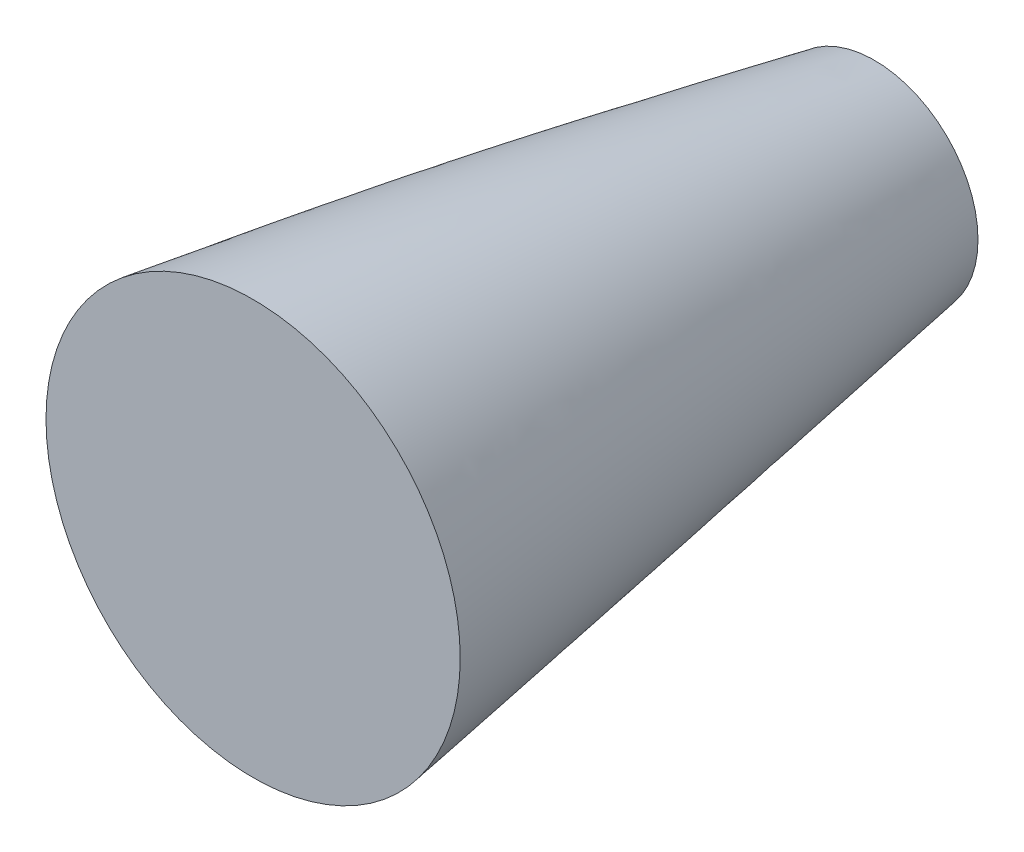
ISO-10303-21;
HEADER;
FILE_DESCRIPTION(('STEP AP214'),'2;1');
FILE_NAME('part.step','',(''),(''),'','','');
FILE_SCHEMA(('AUTOMOTIVE_DESIGN { 1 0 10303 214 1 1 1 1 }'));
ENDSEC;
DATA;
#1=APPLICATION_CONTEXT('core data for automotive mechanical design processes');
#2=APPLICATION_PROTOCOL_DEFINITION('international standard','automotive_design',2000,#1);
#3=PRODUCT_CONTEXT('',#1,'mechanical');
#4=PRODUCT('Part','Part','',(#3));
#5=PRODUCT_RELATED_PRODUCT_CATEGORY('part','',(#4));
#6=PRODUCT_DEFINITION_FORMATION('','',#4);
#7=PRODUCT_DEFINITION_CONTEXT('part definition',#1,'design');
#8=PRODUCT_DEFINITION('design','',#6,#7);
#9=PRODUCT_DEFINITION_SHAPE('','',#8);
#10=(LENGTH_UNIT() NAMED_UNIT(*) SI_UNIT(.MILLI.,.METRE.));
#11=(NAMED_UNIT(*) PLANE_ANGLE_UNIT() SI_UNIT($,.RADIAN.));
#12=(NAMED_UNIT(*) SI_UNIT($,.STERADIAN.) SOLID_ANGLE_UNIT());
#13=UNCERTAINTY_MEASURE_WITH_UNIT(LENGTH_MEASURE(1.E-05),#10,'distance_accuracy_value','');
#14=(GEOMETRIC_REPRESENTATION_CONTEXT(3) GLOBAL_UNCERTAINTY_ASSIGNED_CONTEXT((#13)) GLOBAL_UNIT_ASSIGNED_CONTEXT((#10,
#11,#12)) REPRESENTATION_CONTEXT('',''));
#15=CARTESIAN_POINT('',(0.,0.,0.));
#16=DIRECTION('',(0.,0.,1.));
#17=DIRECTION('',(1.,0.,0.));
#18=AXIS2_PLACEMENT_3D('',#15,#16,#17);
#19=CARTESIAN_POINT('',(0.,0.,30.));
#20=DIRECTION('',(0.,0.,1.));
#21=DIRECTION('',(1.,0.,0.));
#22=AXIS2_PLACEMENT_3D('',#19,#20,#21);
#23=PLANE('',#22);
#24=CARTESIAN_POINT('',(0.,0.,30.));
#25=DIRECTION('',(0.,0.,1.));
#26=DIRECTION('',(1.,0.,0.));
#27=AXIS2_PLACEMENT_3D('',#24,#25,#26);
#28=CIRCLE('',#27,10.);
#29=CARTESIAN_POINT('',(10.,0.,30.));
#30=VERTEX_POINT('',#29);
#31=EDGE_CURVE('E12',#30,#30,#28,.T.);
#32=ORIENTED_EDGE('',*,*,#31,.T.);
#33=EDGE_LOOP('',(#32));
#34=FACE_BOUND('',#33,.T.);
#35=ADVANCED_FACE('F83',(#34),#23,.T.);
#36=CARTESIAN_POINT('',(0.,0.,0.));
#37=DIRECTION('',(0.,0.,1.));
#38=DIRECTION('',(1.,0.,0.));
#39=AXIS2_PLACEMENT_3D('',#36,#37,#38);
#40=PLANE('',#39);
#41=CARTESIAN_POINT('',(0.,0.,0.));
#42=DIRECTION('',(0.,0.,1.));
#43=DIRECTION('',(1.,0.,0.));
#44=AXIS2_PLACEMENT_3D('',#41,#42,#43);
#45=CIRCLE('',#44,5.);
#46=CARTESIAN_POINT('',(5.,0.,0.));
#47=VERTEX_POINT('',#46);
#48=EDGE_CURVE('E90',#47,#47,#45,.T.);
#49=ORIENTED_EDGE('',*,*,#48,.F.);
#50=EDGE_LOOP('',(#49));
#51=FACE_BOUND('',#50,.T.);
#52=ADVANCED_FACE('F115',(#51),#40,.F.);
#53=CARTESIAN_POINT('',(5.,0.,0.));
#54=CARTESIAN_POINT('',(5.93333333333334,0.,5.6));
#55=CARTESIAN_POINT('',(7.6,0.,15.6));
#56=CARTESIAN_POINT('',(9.26666666666667,0.,25.6));
#57=CARTESIAN_POINT('',(10.,0.,30.));
#58=CARTESIAN_POINT('',(5.,0.137978752480774,0.));
#59=CARTESIAN_POINT('',(5.93333333333334,0.165960107597196,5.6));
#60=CARTESIAN_POINT('',(7.6,0.215926813162236,15.6));
#61=CARTESIAN_POINT('',(9.26666666666667,0.257614793578425,25.6));
#62=CARTESIAN_POINT('',(10.,0.275957504961548,30.));
#63=CARTESIAN_POINT('',(4.98879787524808,0.411340506946168,0.));
#64=CARTESIAN_POINT('',(5.91985947742638,0.494758167938815,5.6));
#65=CARTESIAN_POINT('',(7.58246948131622,0.643718276854256,15.6));
#66=CARTESIAN_POINT('',(9.24575161269117,0.767997955352923,25.6));
#67=CARTESIAN_POINT('',(9.97759575049615,0.822681013892336,30.));
#68=CARTESIAN_POINT('',(4.93967927000279,0.812304931017432,0.));
#69=CARTESIAN_POINT('',(5.86077988100325,0.977036038734803,5.6));
#70=CARTESIAN_POINT('',(7.50560240064691,1.27119873108725,15.6));
#71=CARTESIAN_POINT('',(9.15404416409044,1.51662312757865,25.6));
#72=CARTESIAN_POINT('',(9.87935854000559,1.62460986203486,30.));
#73=CARTESIAN_POINT('',(4.85953620277847,1.2029001913235,0.));
#74=CARTESIAN_POINT('',(5.76438422717551,1.44684193465622,5.6));
#75=CARTESIAN_POINT('',(7.38018427074166,1.8824521906075,15.6));
#76=CARTESIAN_POINT('',(9.00441214214116,2.24588843507938,25.6));
#77=CARTESIAN_POINT('',(9.71907240555693,2.405800382647,30.));
#78=CARTESIAN_POINT('',(4.2002767643885,3.47651103373854,0.));
#79=CARTESIAN_POINT('',(4.97143049073037,4.18152892998854,5.6));
#80=CARTESIAN_POINT('',(6.34849071634085,5.44048945900639,15.6));
#81=CARTESIAN_POINT('',(7.77353433608817,6.49085932599993,25.6));
#82=CARTESIAN_POINT('',(8.40055352877699,6.95302206747708,30.));
#83=CARTESIAN_POINT('',(2.2076600396924,5.,0.));
#84=CARTESIAN_POINT('',(2.5747217215551,6.01397333333334,5.6));
#85=CARTESIAN_POINT('',(3.23018901059562,7.82464000000001,15.6));
#86=CARTESIAN_POINT('',(4.05319669725477,9.33530666666667,25.6));
#87=CARTESIAN_POINT('',(4.4153200793848,10.,30.));
#88=CARTESIAN_POINT('',(-2.7595750496155,5.,0.));
#89=CARTESIAN_POINT('',(-3.39984215194396,6.01397333333334,5.6));
#90=CARTESIAN_POINT('',(-4.54317626324479,7.82464000000001,15.6));
#91=CARTESIAN_POINT('',(-5.22093587156855,9.33530666666667,25.6));
#92=CARTESIAN_POINT('',(-5.519150099231,10.,30.));
#93=CARTESIAN_POINT('',(-5.,2.7595750496155,0.));
#94=CARTESIAN_POINT('',(-6.09461333333335,3.31920215194393,5.6));
#95=CARTESIAN_POINT('',(-8.04928000000005,4.31853626324469,15.6));
#96=CARTESIAN_POINT('',(-9.40394666666668,5.15229587156852,25.6));
#97=CARTESIAN_POINT('',(-10.,5.519150099231,30.));
#98=CARTESIAN_POINT('',(-5.,-2.7595750496155,0.));
#99=CARTESIAN_POINT('',(-6.09461333333331,-3.31920215194392,5.6));
#100=CARTESIAN_POINT('',(-8.04927999999995,-4.31853626324468,15.6));
#101=CARTESIAN_POINT('',(-9.40394666666665,-5.15229587156851,25.6));
#102=CARTESIAN_POINT('',(-10.,-5.519150099231,30.));
#103=CARTESIAN_POINT('',(-2.7595750496155,-5.,0.));
#104=CARTESIAN_POINT('',(-3.39984215194389,-6.01397333333333,5.6));
#105=CARTESIAN_POINT('',(-4.54317626324458,-7.82464,15.6));
#106=CARTESIAN_POINT('',(-5.22093587156848,-9.33530666666667,25.6));
#107=CARTESIAN_POINT('',(-5.519150099231,-10.,30.));
#108=CARTESIAN_POINT('',(2.2076600396924,-5.,0.));
#109=CARTESIAN_POINT('',(2.57472172155519,-6.01397333333333,5.6));
#110=CARTESIAN_POINT('',(3.23018901059588,-7.82464,15.6));
#111=CARTESIAN_POINT('',(4.05319669725485,-9.33530666666667,25.6));
#112=CARTESIAN_POINT('',(4.4153200793848,-10.,30.));
#113=CARTESIAN_POINT('',(4.20027676438849,-3.47651103373854,0.));
#114=CARTESIAN_POINT('',(4.97143049073045,-4.18152892998854,5.6));
#115=CARTESIAN_POINT('',(6.34849071634108,-5.44048945900639,15.6));
#116=CARTESIAN_POINT('',(7.77353433608824,-6.49085932599993,25.6));
#117=CARTESIAN_POINT('',(8.40055352877699,-6.95302206747708,30.));
#118=CARTESIAN_POINT('',(4.85953620277847,-1.2029001913235,0.));
#119=CARTESIAN_POINT('',(5.76438422717554,-1.44684193465622,5.6));
#120=CARTESIAN_POINT('',(7.38018427074175,-1.8824521906075,15.6));
#121=CARTESIAN_POINT('',(9.00441214214118,-2.24588843507938,25.6));
#122=CARTESIAN_POINT('',(9.71907240555693,-2.405800382647,30.));
#123=CARTESIAN_POINT('',(4.93967927000279,-0.812304931017433,0.));
#124=CARTESIAN_POINT('',(5.86077988100326,-0.977036038734802,5.6));
#125=CARTESIAN_POINT('',(7.50560240064697,-1.27119873108725,15.6));
#126=CARTESIAN_POINT('',(9.15404416409045,-1.51662312757865,25.6));
#127=CARTESIAN_POINT('',(9.87935854000558,-1.62460986203487,30.));
#128=CARTESIAN_POINT('',(4.98879787524808,-0.41134050694617,0.));
#129=CARTESIAN_POINT('',(5.91985947742639,-0.494758167938816,5.6));
#130=CARTESIAN_POINT('',(7.58246948131624,-0.643718276854254,15.6));
#131=CARTESIAN_POINT('',(9.24575161269118,-0.767997955352926,25.6));
#132=CARTESIAN_POINT('',(9.97759575049615,-0.822681013892341,30.));
#133=CARTESIAN_POINT('',(5.,-0.137978752480775,0.));
#134=CARTESIAN_POINT('',(5.93333333333334,-0.165960107597195,5.6));
#135=CARTESIAN_POINT('',(7.60000000000001,-0.215926813162231,15.6));
#136=CARTESIAN_POINT('',(9.26666666666667,-0.257614793578425,25.6));
#137=CARTESIAN_POINT('',(10.,-0.27595750496155,30.));
#138=CARTESIAN_POINT('',(5.,0.,0.));
#139=CARTESIAN_POINT('',(5.93333333333334,0.,5.6));
#140=CARTESIAN_POINT('',(7.6,0.,15.6));
#141=CARTESIAN_POINT('',(9.26666666666667,0.,25.6));
#142=CARTESIAN_POINT('',(10.,0.,30.));
#143=B_SPLINE_SURFACE_WITH_KNOTS('',3,3,((#53,#54,#55,#56,#57),(#58,#59,#60,#61,#62),(#63,#64,
#65,#66,#67),(#68,#69,#70,#71,#72),(#73,#74,#75,#76,#77),(#78,#79,#80,#81,#82),(#83,#84,#85,#86,
#87),(#88,#89,#90,#91,#92),(#93,#94,#95,#96,#97),(#98,#99,#100,#101,#102),(#103,#104,#105,#106,
#107),(#108,#109,#110,#111,#112),(#113,#114,#115,#116,#117),(#118,#119,#120,#121,#122),(#123,
#124,#125,#126,#127),(#128,#129,#130,#131,#132),(#133,#134,#135,#136,#137),(#138,#139,#140,#141,
#142)),.UNSPECIFIED.,.T.,.F.,.F.,(4,1,1,1,1,2,2,2,1,1,1,1,4),(4,1,4),(0.,0.0125,
0.0249999999999999,0.0375000000000001,0.05,0.25,0.5,0.75,0.95,0.9625,0.975,0.9875,1.),(0.,0.56,
1.),.UNSPECIFIED.);
#144=CARTESIAN_POINT('',(5.,0.,0.));
#145=CARTESIAN_POINT('',(5.05208333333333,0.,0.3125));
#146=CARTESIAN_POINT('',(5.10416666666667,0.,0.625));
#147=CARTESIAN_POINT('',(5.20833333333333,0.,1.25));
#148=CARTESIAN_POINT('',(5.26041666666667,0.,1.5625));
#149=CARTESIAN_POINT('',(5.36458333333333,0.,2.1875));
#150=CARTESIAN_POINT('',(5.41666666666667,0.,2.5));
#151=CARTESIAN_POINT('',(5.52083333333333,0.,3.125));
#152=CARTESIAN_POINT('',(5.57291666666667,0.,3.4375));
#153=CARTESIAN_POINT('',(5.67708333333333,0.,4.0625));
#154=CARTESIAN_POINT('',(5.72916666666667,0.,4.375));
#155=CARTESIAN_POINT('',(5.83333333333333,0.,5.));
#156=CARTESIAN_POINT('',(5.88541666666667,0.,5.3125));
#157=CARTESIAN_POINT('',(5.98958333333333,0.,5.9375));
#158=CARTESIAN_POINT('',(6.04166666666667,0.,6.25));
#159=CARTESIAN_POINT('',(6.14583333333334,0.,6.875));
#160=CARTESIAN_POINT('',(6.19791666666667,0.,7.1875));
#161=CARTESIAN_POINT('',(6.30208333333333,0.,7.8125));
#162=CARTESIAN_POINT('',(6.35416666666667,0.,8.125));
#163=CARTESIAN_POINT('',(6.45833333333334,0.,8.75));
#164=CARTESIAN_POINT('',(6.51041666666667,0.,9.0625));
#165=CARTESIAN_POINT('',(6.61458333333334,0.,9.6875));
#166=CARTESIAN_POINT('',(6.66666666666667,0.,10.));
#167=CARTESIAN_POINT('',(6.77083333333334,0.,10.625));
#168=CARTESIAN_POINT('',(6.82291666666667,0.,10.9375));
#169=CARTESIAN_POINT('',(6.92708333333334,0.,11.5625));
#170=CARTESIAN_POINT('',(6.97916666666667,0.,11.875));
#171=CARTESIAN_POINT('',(7.08333333333334,0.,12.5));
#172=CARTESIAN_POINT('',(7.13541666666667,0.,12.8125));
#173=CARTESIAN_POINT('',(7.23958333333334,0.,13.4375));
#174=CARTESIAN_POINT('',(7.29166666666667,0.,13.75));
#175=CARTESIAN_POINT('',(7.39583333333334,0.,14.375));
#176=CARTESIAN_POINT('',(7.44791666666667,0.,14.6875));
#177=CARTESIAN_POINT('',(7.55208333333334,0.,15.3125));
#178=CARTESIAN_POINT('',(7.60416666666667,0.,15.625));
#179=CARTESIAN_POINT('',(7.70833333333334,0.,16.25));
#180=CARTESIAN_POINT('',(7.76041666666667,0.,16.5625));
#181=CARTESIAN_POINT('',(7.86458333333334,0.,17.1875));
#182=CARTESIAN_POINT('',(7.91666666666667,0.,17.5));
#183=CARTESIAN_POINT('',(8.02083333333334,0.,18.125));
#184=CARTESIAN_POINT('',(8.07291666666667,0.,18.4375));
#185=CARTESIAN_POINT('',(8.17708333333334,0.,19.0625));
#186=CARTESIAN_POINT('',(8.22916666666667,0.,19.375));
#187=CARTESIAN_POINT('',(8.33333333333334,0.,20.));
#188=CARTESIAN_POINT('',(8.38541666666667,0.,20.3125));
#189=CARTESIAN_POINT('',(8.48958333333333,0.,20.9375));
#190=CARTESIAN_POINT('',(8.54166666666667,0.,21.25));
#191=CARTESIAN_POINT('',(8.64583333333334,0.,21.875));
#192=CARTESIAN_POINT('',(8.69791666666667,0.,22.1875));
#193=CARTESIAN_POINT('',(8.80208333333333,0.,22.8125));
#194=CARTESIAN_POINT('',(8.85416666666667,0.,23.125));
#195=CARTESIAN_POINT('',(8.95833333333333,0.,23.75));
#196=CARTESIAN_POINT('',(9.01041666666667,0.,24.0625));
#197=CARTESIAN_POINT('',(9.11458333333333,0.,24.6875));
#198=CARTESIAN_POINT('',(9.16666666666667,0.,25.));
#199=CARTESIAN_POINT('',(9.27083333333333,0.,25.625));
#200=CARTESIAN_POINT('',(9.32291666666667,0.,25.9375));
#201=CARTESIAN_POINT('',(9.42708333333333,0.,26.5625));
#202=CARTESIAN_POINT('',(9.47916666666667,0.,26.875));
#203=CARTESIAN_POINT('',(9.58333333333333,0.,27.5));
#204=CARTESIAN_POINT('',(9.63541666666667,0.,27.8125));
#205=CARTESIAN_POINT('',(9.73958333333333,0.,28.4375));
#206=CARTESIAN_POINT('',(9.79166666666667,0.,28.75));
#207=CARTESIAN_POINT('',(9.89583333333333,0.,29.375));
#208=CARTESIAN_POINT('',(9.94791666666666,0.,29.6875));
#209=CARTESIAN_POINT('',(10.,0.,30.));
#210=B_SPLINE_CURVE_WITH_KNOTS('',3,(#144,#145,#146,#147,#148,#149,#150,#151,#152,#153,#154,
#155,#156,#157,#158,#159,#160,#161,#162,#163,#164,#165,#166,#167,#168,#169,#170,#171,#172,#173,
#174,#175,#176,#177,#178,#179,#180,#181,#182,#183,#184,#185,#186,#187,#188,#189,#190,#191,#192,
#193,#194,#195,#196,#197,#198,#199,#200,#201,#202,#203,#204,#205,#206,#207,#208,#209),
.UNSPECIFIED.,.F.,.F.,(4,2,2,2,2,2,2,2,2,2,2,2,2,2,2,2,2,2,2,2,2,2,2,2,2,2,2,2,2,2,2,2,4),(0.,
0.950431645359097,1.90086329071819,2.85129493607729,3.80172658143639,4.75215822679548,
5.70258987215458,6.65302151751368,7.60345316287278,8.55388480823187,9.50431645359097,
10.4547480989501,11.4051797443092,12.3556113896683,13.3060430350274,14.2564746803865,
15.2069063257456,16.1573379711047,17.1077696164637,18.0582012618228,19.0086329071819,
19.959064552541,20.9094961979001,21.8599278432592,22.8103594886183,23.7607911339774,
24.7112227793365,25.6616544246956,26.6120860700547,27.5625177154138,28.5129493607729,
29.463381006132,30.4138126514911),.UNSPECIFIED.);
#211=EDGE_CURVE('BSEAM116',#47,#30,#210,.T.);
#212=ORIENTED_EDGE('',*,*,#48,.T.);
#213=ORIENTED_EDGE('',*,*,#31,.F.);
#214=ORIENTED_EDGE('',*,*,#211,.T.);
#215=ORIENTED_EDGE('',*,*,#211,.F.);
#216=EDGE_LOOP('',(#212,#214,#213,#215));
#217=FACE_BOUND('',#216,.T.);
#218=ADVANCED_FACE('F116',(#217),#143,.T.);
#219=CLOSED_SHELL('',(#35,#52,#218));
#220=MANIFOLD_SOLID_BREP('B2',#219);
#221=ADVANCED_BREP_SHAPE_REPRESENTATION('',(#18,#220),#14);
#222=SHAPE_DEFINITION_REPRESENTATION(#9,#221);
ENDSEC;
END-ISO-10303-21;
